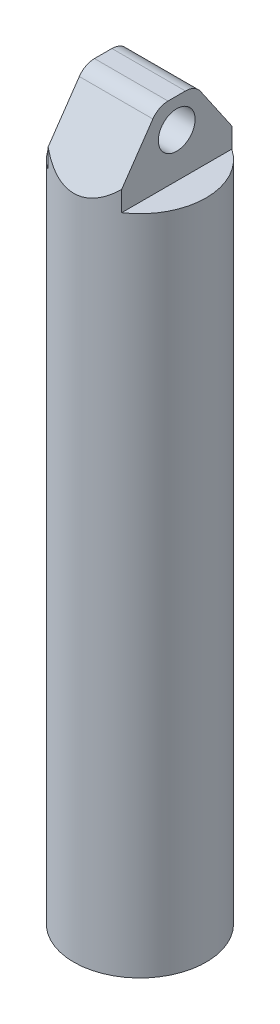
ISO-10303-21;
HEADER;
FILE_DESCRIPTION(('STEP AP214'),'2;1');
FILE_NAME('part.step','',(''),(''),'','','');
FILE_SCHEMA(('AUTOMOTIVE_DESIGN { 1 0 10303 214 1 1 1 1 }'));
ENDSEC;
DATA;
#1=APPLICATION_CONTEXT('core data for automotive mechanical design processes');
#2=APPLICATION_PROTOCOL_DEFINITION('international standard','automotive_design',2000,#1);
#3=PRODUCT_CONTEXT('',#1,'mechanical');
#4=PRODUCT('Part','Part','',(#3));
#5=PRODUCT_RELATED_PRODUCT_CATEGORY('part','',(#4));
#6=PRODUCT_DEFINITION_FORMATION('','',#4);
#7=PRODUCT_DEFINITION_CONTEXT('part definition',#1,'design');
#8=PRODUCT_DEFINITION('design','',#6,#7);
#9=PRODUCT_DEFINITION_SHAPE('','',#8);
#10=(LENGTH_UNIT() NAMED_UNIT(*) SI_UNIT(.MILLI.,.METRE.));
#11=(NAMED_UNIT(*) PLANE_ANGLE_UNIT() SI_UNIT($,.RADIAN.));
#12=(NAMED_UNIT(*) SI_UNIT($,.STERADIAN.) SOLID_ANGLE_UNIT());
#13=UNCERTAINTY_MEASURE_WITH_UNIT(LENGTH_MEASURE(1.E-05),#10,'distance_accuracy_value','');
#14=(GEOMETRIC_REPRESENTATION_CONTEXT(3) GLOBAL_UNCERTAINTY_ASSIGNED_CONTEXT((#13)) GLOBAL_UNIT_ASSIGNED_CONTEXT((#10,
#11,#12)) REPRESENTATION_CONTEXT('',''));
#15=CARTESIAN_POINT('',(0.,0.,0.));
#16=DIRECTION('',(0.,0.,1.));
#17=DIRECTION('',(1.,0.,0.));
#18=AXIS2_PLACEMENT_3D('',#15,#16,#17);
#19=CARTESIAN_POINT('',(0.,180.,0.));
#20=DIRECTION('',(0.,1.,0.));
#21=DIRECTION('',(0.,0.,1.));
#22=AXIS2_PLACEMENT_3D('',#19,#20,#21);
#23=PLANE('',#22);
#24=CARTESIAN_POINT('',(0.,180.,0.));
#25=DIRECTION('',(0.,1.,0.));
#26=DIRECTION('',(0.,0.,1.));
#27=AXIS2_PLACEMENT_3D('',#24,#25,#26);
#28=CIRCLE('',#27,18.);
#29=CARTESIAN_POINT('',(-10.,180.,-14.9666295470958));
#30=VERTEX_POINT('',#29);
#31=CARTESIAN_POINT('',(-10.,180.,14.9666295470958));
#32=VERTEX_POINT('',#31);
#33=EDGE_CURVE('E127',#30,#32,#28,.T.);
#34=ORIENTED_EDGE('',*,*,#33,.T.);
#35=DIRECTION('',(0.,0.,-1.));
#36=VECTOR('',#35,1.);
#37=CARTESIAN_POINT('',(-10.,180.,-18.7291625664917));
#38=LINE('',#37,#36);
#39=EDGE_CURVE('E123',#32,#30,#38,.T.);
#40=ORIENTED_EDGE('',*,*,#39,.T.);
#41=EDGE_LOOP('',(#34,#40));
#42=FACE_BOUND('',#41,.T.);
#43=ADVANCED_FACE('F51',(#42),#23,.T.);
#44=CARTESIAN_POINT('',(0.,180.,0.));
#45=DIRECTION('',(0.,-1.,0.));
#46=DIRECTION('',(0.,0.,-1.));
#47=AXIS2_PLACEMENT_3D('',#44,#45,#46);
#48=CYLINDRICAL_SURFACE('',#47,18.);
#49=CARTESIAN_POINT('',(10.,180.,14.9666295470957));
#50=VERTEX_POINT('',#49);
#51=CARTESIAN_POINT('',(10.,180.,-14.9666295470958));
#52=VERTEX_POINT('',#51);
#53=EDGE_CURVE('E116',#50,#52,#28,.T.);
#54=ORIENTED_EDGE('',*,*,#53,.F.);
#55=DIRECTION('',(0.,-1.,0.));
#56=VECTOR('',#55,1.);
#57=CARTESIAN_POINT('',(10.,195.,14.9666295470958));
#58=LINE('',#57,#56);
#59=CARTESIAN_POINT('',(10.,185.481081604466,14.9666295470958));
#60=VERTEX_POINT('',#59);
#61=EDGE_CURVE('E60',#60,#50,#58,.T.);
#62=ORIENTED_EDGE('',*,*,#61,.F.);
#63=CARTESIAN_POINT('',(0.,207.283765452968,0.));
#64=DIRECTION('',(0.,0.565945406006889,0.824442719307835));
#65=DIRECTION('',(0.,-0.824442719307835,0.565945406006889));
#66=AXIS2_PLACEMENT_3D('',#63,#64,#65);
#67=ELLIPSE('',#66,31.8051879367688,18.);
#68=CARTESIAN_POINT('',(-10.,185.481081604466,14.9666295470958));
#69=VERTEX_POINT('',#68);
#70=EDGE_CURVE('E224',#60,#69,#67,.F.);
#71=ORIENTED_EDGE('',*,*,#70,.T.);
#72=DIRECTION('',(0.,-1.,0.));
#73=VECTOR('',#72,1.);
#74=CARTESIAN_POINT('',(-10.,217.,14.9666295470958));
#75=LINE('',#74,#73);
#76=EDGE_CURVE('E227',#69,#32,#75,.T.);
#77=ORIENTED_EDGE('',*,*,#76,.T.);
#78=ORIENTED_EDGE('',*,*,#33,.F.);
#79=DIRECTION('',(0.,-1.,0.));
#80=VECTOR('',#79,1.);
#81=CARTESIAN_POINT('',(-10.,217.,-14.9666295470958));
#82=LINE('',#81,#80);
#83=CARTESIAN_POINT('',(-10.,185.481081604466,-14.9666295470958));
#84=VERTEX_POINT('',#83);
#85=EDGE_CURVE('E221',#30,#84,#82,.F.);
#86=ORIENTED_EDGE('',*,*,#85,.T.);
#87=CARTESIAN_POINT('',(0.,207.283765452968,0.));
#88=DIRECTION('',(0.,0.565945406006889,-0.824442719307835));
#89=DIRECTION('',(0.,-0.824442719307835,-0.565945406006889));
#90=AXIS2_PLACEMENT_3D('',#87,#88,#89);
#91=ELLIPSE('',#90,31.8051879367688,18.);
#92=CARTESIAN_POINT('',(10.,185.481081604466,-14.9666295470958));
#93=VERTEX_POINT('',#92);
#94=EDGE_CURVE('E67',#84,#93,#91,.F.);
#95=ORIENTED_EDGE('',*,*,#94,.T.);
#96=DIRECTION('',(0.,-1.,0.));
#97=VECTOR('',#96,1.);
#98=CARTESIAN_POINT('',(10.,217.,-14.9666295470958));
#99=LINE('',#98,#97);
#100=EDGE_CURVE('E12',#52,#93,#99,.F.);
#101=ORIENTED_EDGE('',*,*,#100,.F.);
#102=EDGE_LOOP('',(#54,#62,#71,#77,#78,#86,#95,#101));
#103=FACE_BOUND('',#102,.T.);
#104=CARTESIAN_POINT('',(0.,0.,0.));
#105=DIRECTION('',(0.,1.,0.));
#106=DIRECTION('',(0.,0.,1.));
#107=AXIS2_PLACEMENT_3D('',#104,#105,#106);
#108=CIRCLE('',#107,18.);
#109=CARTESIAN_POINT('',(0.,0.,18.));
#110=VERTEX_POINT('',#109);
#111=EDGE_CURVE('E134',#110,#110,#108,.T.);
#112=ORIENTED_EDGE('',*,*,#111,.T.);
#113=EDGE_LOOP('',(#112));
#114=FACE_BOUND('',#113,.T.);
#115=ADVANCED_FACE('F53',(#103,#114),#48,.T.);
#116=DIRECTION('',(0.,0.,-1.));
#117=VECTOR('',#116,1.);
#118=CARTESIAN_POINT('',(10.,180.,-18.7291625664917));
#119=LINE('',#118,#117);
#120=EDGE_CURVE('E118',#50,#52,#119,.T.);
#121=ORIENTED_EDGE('',*,*,#120,.F.);
#122=ORIENTED_EDGE('',*,*,#53,.T.);
#123=EDGE_LOOP('',(#121,#122));
#124=FACE_BOUND('',#123,.T.);
#125=ADVANCED_FACE('F125',(#124),#23,.T.);
#126=CARTESIAN_POINT('',(0.,0.,0.));
#127=DIRECTION('',(0.,1.,0.));
#128=DIRECTION('',(0.,0.,1.));
#129=AXIS2_PLACEMENT_3D('',#126,#127,#128);
#130=PLANE('',#129);
#131=ORIENTED_EDGE('',*,*,#111,.F.);
#132=EDGE_LOOP('',(#131));
#133=FACE_BOUND('',#132,.T.);
#134=CARTESIAN_POINT('',(0.,0.,0.));
#135=DIRECTION('',(0.,-1.,0.));
#136=DIRECTION('',(0.,0.,-1.));
#137=AXIS2_PLACEMENT_3D('',#134,#135,#136);
#138=CIRCLE('',#137,10.);
#139=CARTESIAN_POINT('',(0.,0.,-10.));
#140=VERTEX_POINT('',#139);
#141=EDGE_CURVE('E155',#140,#140,#138,.T.);
#142=ORIENTED_EDGE('',*,*,#141,.F.);
#143=EDGE_LOOP('',(#142));
#144=FACE_BOUND('',#143,.T.);
#145=ADVANCED_FACE('F247',(#133,#144),#130,.F.);
#146=CARTESIAN_POINT('',(0.,5.,0.));
#147=DIRECTION('',(0.,-1.,0.));
#148=DIRECTION('',(0.,0.,-1.));
#149=AXIS2_PLACEMENT_3D('',#146,#147,#148);
#150=PLANE('',#149);
#151=CARTESIAN_POINT('',(0.,5.,0.));
#152=DIRECTION('',(0.,-1.,0.));
#153=DIRECTION('',(0.,0.,-1.));
#154=AXIS2_PLACEMENT_3D('',#151,#152,#153);
#155=CIRCLE('',#154,10.);
#156=CARTESIAN_POINT('',(0.,5.,-10.));
#157=VERTEX_POINT('',#156);
#158=EDGE_CURVE('E150',#157,#157,#155,.T.);
#159=ORIENTED_EDGE('',*,*,#158,.T.);
#160=EDGE_LOOP('',(#159));
#161=FACE_BOUND('',#160,.T.);
#162=CARTESIAN_POINT('',(0.,5.,0.));
#163=DIRECTION('',(0.,-1.,0.));
#164=DIRECTION('',(0.,0.,-1.));
#165=AXIS2_PLACEMENT_3D('',#162,#163,#164);
#166=CIRCLE('',#165,17.);
#167=CARTESIAN_POINT('',(0.,4.99999999999998,-17.));
#168=VERTEX_POINT('',#167);
#169=EDGE_CURVE('E145',#168,#168,#166,.T.);
#170=ORIENTED_EDGE('',*,*,#169,.F.);
#171=EDGE_LOOP('',(#170));
#172=FACE_BOUND('',#171,.T.);
#173=ADVANCED_FACE('F252',(#161,#172),#150,.F.);
#174=CARTESIAN_POINT('',(0.,5.,0.));
#175=DIRECTION('',(0.,-1.,0.));
#176=DIRECTION('',(0.,0.,-1.));
#177=AXIS2_PLACEMENT_3D('',#174,#175,#176);
#178=CYLINDRICAL_SURFACE('',#177,10.);
#179=ORIENTED_EDGE('',*,*,#158,.F.);
#180=EDGE_LOOP('',(#179));
#181=FACE_BOUND('',#180,.T.);
#182=ORIENTED_EDGE('',*,*,#141,.T.);
#183=EDGE_LOOP('',(#182));
#184=FACE_BOUND('',#183,.T.);
#185=ADVANCED_FACE('F258',(#181,#184),#178,.F.);
#186=CARTESIAN_POINT('',(0.,179.,0.));
#187=DIRECTION('',(0.,1.,0.));
#188=DIRECTION('',(0.,0.,1.));
#189=AXIS2_PLACEMENT_3D('',#186,#187,#188);
#190=PLANE('',#189);
#191=CARTESIAN_POINT('',(0.,179.,0.));
#192=DIRECTION('',(0.,1.,0.));
#193=DIRECTION('',(0.,0.,1.));
#194=AXIS2_PLACEMENT_3D('',#191,#192,#193);
#195=CIRCLE('',#194,17.);
#196=CARTESIAN_POINT('',(0.,179.,-17.));
#197=VERTEX_POINT('',#196);
#198=EDGE_CURVE('E137',#197,#197,#195,.T.);
#199=ORIENTED_EDGE('',*,*,#198,.F.);
#200=EDGE_LOOP('',(#199));
#201=FACE_BOUND('',#200,.T.);
#202=ADVANCED_FACE('F265',(#201),#190,.F.);
#203=CARTESIAN_POINT('',(0.,180.,0.));
#204=DIRECTION('',(0.,-1.,0.));
#205=DIRECTION('',(0.,0.,-1.));
#206=AXIS2_PLACEMENT_3D('',#203,#204,#205);
#207=CYLINDRICAL_SURFACE('',#206,17.);
#208=CARTESIAN_POINT('',(0.,179.,-17.));
#209=CARTESIAN_POINT('',(0.,177.1875,-17.));
#210=CARTESIAN_POINT('',(0.,175.375,-17.));
#211=CARTESIAN_POINT('',(0.,171.75,-17.));
#212=CARTESIAN_POINT('',(0.,169.9375,-17.));
#213=CARTESIAN_POINT('',(0.,166.3125,-17.));
#214=CARTESIAN_POINT('',(0.,164.5,-17.));
#215=CARTESIAN_POINT('',(0.,160.875,-17.));
#216=CARTESIAN_POINT('',(0.,159.0625,-17.));
#217=CARTESIAN_POINT('',(0.,155.4375,-17.));
#218=CARTESIAN_POINT('',(0.,153.625,-17.));
#219=CARTESIAN_POINT('',(0.,150.,-17.));
#220=CARTESIAN_POINT('',(0.,148.1875,-17.));
#221=CARTESIAN_POINT('',(0.,144.5625,-17.));
#222=CARTESIAN_POINT('',(0.,142.75,-17.));
#223=CARTESIAN_POINT('',(0.,139.125,-17.));
#224=CARTESIAN_POINT('',(0.,137.3125,-17.));
#225=CARTESIAN_POINT('',(0.,133.6875,-17.));
#226=CARTESIAN_POINT('',(0.,131.875,-17.));
#227=CARTESIAN_POINT('',(0.,128.25,-17.));
#228=CARTESIAN_POINT('',(0.,126.4375,-17.));
#229=CARTESIAN_POINT('',(0.,122.8125,-17.));
#230=CARTESIAN_POINT('',(0.,121.,-17.));
#231=CARTESIAN_POINT('',(0.,117.375,-17.));
#232=CARTESIAN_POINT('',(0.,115.5625,-17.));
#233=CARTESIAN_POINT('',(0.,111.9375,-17.));
#234=CARTESIAN_POINT('',(0.,110.125,-17.));
#235=CARTESIAN_POINT('',(0.,106.5,-17.));
#236=CARTESIAN_POINT('',(0.,104.6875,-17.));
#237=CARTESIAN_POINT('',(0.,101.0625,-17.));
#238=CARTESIAN_POINT('',(0.,99.25,-17.));
#239=CARTESIAN_POINT('',(0.,95.625,-17.));
#240=CARTESIAN_POINT('',(0.,93.8125,-17.));
#241=CARTESIAN_POINT('',(0.,90.1875,-17.));
#242=CARTESIAN_POINT('',(0.,88.375,-17.));
#243=CARTESIAN_POINT('',(0.,84.75,-17.));
#244=CARTESIAN_POINT('',(0.,82.9375,-17.));
#245=CARTESIAN_POINT('',(0.,79.3125,-17.));
#246=CARTESIAN_POINT('',(0.,77.5,-17.));
#247=CARTESIAN_POINT('',(0.,73.875,-17.));
#248=CARTESIAN_POINT('',(0.,72.0625,-17.));
#249=CARTESIAN_POINT('',(0.,68.4375,-17.));
#250=CARTESIAN_POINT('',(0.,66.625,-17.));
#251=CARTESIAN_POINT('',(0.,63.,-17.));
#252=CARTESIAN_POINT('',(0.,61.1875,-17.));
#253=CARTESIAN_POINT('',(0.,57.5625,-17.));
#254=CARTESIAN_POINT('',(0.,55.75,-17.));
#255=CARTESIAN_POINT('',(0.,52.125,-17.));
#256=CARTESIAN_POINT('',(0.,50.3125,-17.));
#257=CARTESIAN_POINT('',(0.,46.6875,-17.));
#258=CARTESIAN_POINT('',(0.,44.875,-17.));
#259=CARTESIAN_POINT('',(0.,41.25,-17.));
#260=CARTESIAN_POINT('',(0.,39.4375,-17.));
#261=CARTESIAN_POINT('',(0.,35.8125,-17.));
#262=CARTESIAN_POINT('',(0.,34.,-17.));
#263=CARTESIAN_POINT('',(0.,30.375,-17.));
#264=CARTESIAN_POINT('',(0.,28.5625,-17.));
#265=CARTESIAN_POINT('',(0.,24.9375,-17.));
#266=CARTESIAN_POINT('',(0.,23.125,-17.));
#267=CARTESIAN_POINT('',(0.,19.5,-17.));
#268=CARTESIAN_POINT('',(0.,17.6875,-17.));
#269=CARTESIAN_POINT('',(0.,14.0625,-17.));
#270=CARTESIAN_POINT('',(0.,12.25,-17.));
#271=CARTESIAN_POINT('',(0.,8.62499999999999,-17.));
#272=CARTESIAN_POINT('',(0.,6.81249999999998,-17.));
#273=CARTESIAN_POINT('',(0.,4.99999999999998,-17.));
#274=B_SPLINE_CURVE_WITH_KNOTS('',3,(#208,#209,#210,#211,#212,#213,#214,#215,#216,#217,#218,
#219,#220,#221,#222,#223,#224,#225,#226,#227,#228,#229,#230,#231,#232,#233,#234,#235,#236,#237,
#238,#239,#240,#241,#242,#243,#244,#245,#246,#247,#248,#249,#250,#251,#252,#253,#254,#255,#256,
#257,#258,#259,#260,#261,#262,#263,#264,#265,#266,#267,#268,#269,#270,#271,#272,#273),
.UNSPECIFIED.,.F.,.F.,(4,2,2,2,2,2,2,2,2,2,2,2,2,2,2,2,2,2,2,2,2,2,2,2,2,2,2,2,2,2,2,2,4),(0.,
5.43749999999998,10.875,16.3125,21.75,27.1875,32.625,38.0625,43.5,48.9375,54.375,59.8125,65.25,
70.6875,76.125,81.5625,87.,92.4375,97.875,103.3125,108.75,114.1875,119.625,125.0625,130.5,
135.9375,141.375,146.8125,152.25,157.6875,163.125,168.5625,174.),.UNSPECIFIED.);
#275=EDGE_CURVE('BSEAM271',#197,#168,#274,.T.);
#276=ORIENTED_EDGE('',*,*,#198,.T.);
#277=ORIENTED_EDGE('',*,*,#169,.T.);
#278=ORIENTED_EDGE('',*,*,#275,.T.);
#279=ORIENTED_EDGE('',*,*,#275,.F.);
#280=EDGE_LOOP('',(#276,#278,#277,#279));
#281=FACE_BOUND('',#280,.T.);
#282=ADVANCED_FACE('F271',(#281),#207,.F.);
#283=CARTESIAN_POINT('',(-10.,195.,-2.36758792437682));
#284=DIRECTION('',(1.,0.,0.));
#285=DIRECTION('',(0.,0.,-1.));
#286=AXIS2_PLACEMENT_3D('',#283,#284,#285);
#287=CYLINDRICAL_SURFACE('',#286,5.00000000000005);
#288=DIRECTION('',(1.,0.,0.));
#289=VECTOR('',#288,1.);
#290=CARTESIAN_POINT('',(-10.,200.,-2.36758792437682));
#291=LINE('',#290,#289);
#292=CARTESIAN_POINT('',(-10.,200.,-2.36758792437682));
#293=VERTEX_POINT('',#292);
#294=CARTESIAN_POINT('',(10.,200.,-2.36758792437682));
#295=VERTEX_POINT('',#294);
#296=EDGE_CURVE('E162',#293,#295,#291,.T.);
#297=ORIENTED_EDGE('',*,*,#296,.T.);
#298=CARTESIAN_POINT('',(10.,195.,-2.36758792437682));
#299=DIRECTION('',(1.,0.,0.));
#300=DIRECTION('',(0.,0.,1.));
#301=AXIS2_PLACEMENT_3D('',#298,#299,#300);
#302=CIRCLE('',#301,5.00000000000005);
#303=CARTESIAN_POINT('',(10.,197.829727030034,-6.489801520916));
#304=VERTEX_POINT('',#303);
#305=EDGE_CURVE('E211',#304,#295,#302,.T.);
#306=ORIENTED_EDGE('',*,*,#305,.F.);
#307=DIRECTION('',(1.,0.,0.));
#308=VECTOR('',#307,1.);
#309=CARTESIAN_POINT('',(-10.,197.829727030034,-6.489801520916));
#310=LINE('',#309,#308);
#311=CARTESIAN_POINT('',(-10.,197.829727030034,-6.489801520916));
#312=VERTEX_POINT('',#311);
#313=EDGE_CURVE('E160',#312,#304,#310,.T.);
#314=ORIENTED_EDGE('',*,*,#313,.F.);
#315=CARTESIAN_POINT('',(-10.,195.,-2.36758792437682));
#316=DIRECTION('',(1.,0.,0.));
#317=DIRECTION('',(0.,0.,1.));
#318=AXIS2_PLACEMENT_3D('',#315,#316,#317);
#319=CIRCLE('',#318,5.00000000000005);
#320=EDGE_CURVE('E189',#312,#293,#319,.T.);
#321=ORIENTED_EDGE('',*,*,#320,.T.);
#322=EDGE_LOOP('',(#297,#306,#314,#321));
#323=FACE_BOUND('',#322,.T.);
#324=ADVANCED_FACE('F275',(#323),#287,.T.);
#325=CARTESIAN_POINT('',(-10.,197.829727030034,-6.489801520916));
#326=DIRECTION('',(0.,0.565945406006889,-0.824442719307835));
#327=DIRECTION('',(0.,0.824442719307835,0.565945406006889));
#328=AXIS2_PLACEMENT_3D('',#325,#326,#327);
#329=PLANE('',#328);
#330=ORIENTED_EDGE('',*,*,#94,.F.);
#331=DIRECTION('',(0.,0.824442719307835,0.565945406006889));
#332=VECTOR('',#331,1.);
#333=CARTESIAN_POINT('',(-10.,197.829727030034,-6.489801520916));
#334=LINE('',#333,#332);
#335=EDGE_CURVE('E166',#84,#312,#334,.T.);
#336=ORIENTED_EDGE('',*,*,#335,.T.);
#337=ORIENTED_EDGE('',*,*,#313,.T.);
#338=DIRECTION('',(0.,0.824442719307835,0.565945406006889));
#339=VECTOR('',#338,1.);
#340=CARTESIAN_POINT('',(10.,197.829727030034,-6.489801520916));
#341=LINE('',#340,#339);
#342=EDGE_CURVE('E197',#93,#304,#341,.T.);
#343=ORIENTED_EDGE('',*,*,#342,.F.);
#344=EDGE_LOOP('',(#330,#336,#337,#343));
#345=FACE_BOUND('',#344,.T.);
#346=ADVANCED_FACE('F281',(#345),#329,.T.);
#347=CARTESIAN_POINT('',(-10.,197.829727030034,6.489801520916));
#348=DIRECTION('',(0.,0.565945406006889,0.824442719307835));
#349=DIRECTION('',(0.,-0.824442719307835,0.565945406006889));
#350=AXIS2_PLACEMENT_3D('',#347,#348,#349);
#351=PLANE('',#350);
#352=ORIENTED_EDGE('',*,*,#70,.F.);
#353=DIRECTION('',(0.,-0.824442719307835,0.565945406006889));
#354=VECTOR('',#353,1.);
#355=CARTESIAN_POINT('',(10.,197.829727030034,6.489801520916));
#356=LINE('',#355,#354);
#357=CARTESIAN_POINT('',(10.,197.829727030034,6.48980152091603));
#358=VERTEX_POINT('',#357);
#359=EDGE_CURVE('E199',#358,#60,#356,.T.);
#360=ORIENTED_EDGE('',*,*,#359,.F.);
#361=DIRECTION('',(1.,0.,0.));
#362=VECTOR('',#361,1.);
#363=CARTESIAN_POINT('',(-10.,197.829727030034,6.48980152091603));
#364=LINE('',#363,#362);
#365=CARTESIAN_POINT('',(-10.,197.829727030034,6.48980152091603));
#366=VERTEX_POINT('',#365);
#367=EDGE_CURVE('E169',#366,#358,#364,.T.);
#368=ORIENTED_EDGE('',*,*,#367,.F.);
#369=DIRECTION('',(0.,-0.824442719307835,0.565945406006889));
#370=VECTOR('',#369,1.);
#371=CARTESIAN_POINT('',(-10.,197.829727030034,6.489801520916));
#372=LINE('',#371,#370);
#373=EDGE_CURVE('E176',#366,#69,#372,.T.);
#374=ORIENTED_EDGE('',*,*,#373,.T.);
#375=EDGE_LOOP('',(#352,#360,#368,#374));
#376=FACE_BOUND('',#375,.T.);
#377=ADVANCED_FACE('F286',(#376),#351,.T.);
#378=CARTESIAN_POINT('',(-10.,195.,2.36758792437682));
#379=DIRECTION('',(1.,0.,0.));
#380=DIRECTION('',(0.,0.,-1.));
#381=AXIS2_PLACEMENT_3D('',#378,#379,#380);
#382=CYLINDRICAL_SURFACE('',#381,5.00000000000005);
#383=ORIENTED_EDGE('',*,*,#367,.T.);
#384=CARTESIAN_POINT('',(10.,195.,2.36758792437682));
#385=DIRECTION('',(1.,0.,0.));
#386=DIRECTION('',(0.,0.,-1.));
#387=AXIS2_PLACEMENT_3D('',#384,#385,#386);
#388=CIRCLE('',#387,5.00000000000005);
#389=CARTESIAN_POINT('',(10.,200.,2.36758792437682));
#390=VERTEX_POINT('',#389);
#391=EDGE_CURVE('E203',#390,#358,#388,.T.);
#392=ORIENTED_EDGE('',*,*,#391,.F.);
#393=DIRECTION('',(1.,0.,0.));
#394=VECTOR('',#393,1.);
#395=CARTESIAN_POINT('',(-10.,200.,2.36758792437682));
#396=LINE('',#395,#394);
#397=CARTESIAN_POINT('',(-10.,200.,2.36758792437682));
#398=VERTEX_POINT('',#397);
#399=EDGE_CURVE('E165',#398,#390,#396,.T.);
#400=ORIENTED_EDGE('',*,*,#399,.F.);
#401=CARTESIAN_POINT('',(-10.,195.,2.36758792437682));
#402=DIRECTION('',(1.,0.,0.));
#403=DIRECTION('',(0.,0.,-1.));
#404=AXIS2_PLACEMENT_3D('',#401,#402,#403);
#405=CIRCLE('',#404,5.00000000000005);
#406=EDGE_CURVE('E181',#398,#366,#405,.T.);
#407=ORIENTED_EDGE('',*,*,#406,.T.);
#408=EDGE_LOOP('',(#383,#392,#400,#407));
#409=FACE_BOUND('',#408,.T.);
#410=ADVANCED_FACE('F299',(#409),#382,.T.);
#411=CARTESIAN_POINT('',(-10.,200.,2.36758792437682));
#412=DIRECTION('',(0.,1.,0.));
#413=DIRECTION('',(0.,0.,1.));
#414=AXIS2_PLACEMENT_3D('',#411,#412,#413);
#415=PLANE('',#414);
#416=ORIENTED_EDGE('',*,*,#399,.T.);
#417=DIRECTION('',(0.,0.,1.));
#418=VECTOR('',#417,1.);
#419=CARTESIAN_POINT('',(10.,200.,2.36758792437682));
#420=LINE('',#419,#418);
#421=EDGE_CURVE('E207',#295,#390,#420,.T.);
#422=ORIENTED_EDGE('',*,*,#421,.F.);
#423=ORIENTED_EDGE('',*,*,#296,.F.);
#424=DIRECTION('',(0.,0.,1.));
#425=VECTOR('',#424,1.);
#426=CARTESIAN_POINT('',(-10.,200.,2.36758792437682));
#427=LINE('',#426,#425);
#428=EDGE_CURVE('E185',#293,#398,#427,.T.);
#429=ORIENTED_EDGE('',*,*,#428,.T.);
#430=EDGE_LOOP('',(#416,#422,#423,#429));
#431=FACE_BOUND('',#430,.T.);
#432=ADVANCED_FACE('F295',(#431),#415,.T.);
#433=CARTESIAN_POINT('',(-10.,195.,-2.36758792437682));
#434=DIRECTION('',(-1.,0.,0.));
#435=DIRECTION('',(0.,0.,1.));
#436=AXIS2_PLACEMENT_3D('',#433,#434,#435);
#437=PLANE('',#436);
#438=ORIENTED_EDGE('',*,*,#85,.F.);
#439=ORIENTED_EDGE('',*,*,#39,.F.);
#440=ORIENTED_EDGE('',*,*,#76,.F.);
#441=ORIENTED_EDGE('',*,*,#373,.F.);
#442=ORIENTED_EDGE('',*,*,#406,.F.);
#443=ORIENTED_EDGE('',*,*,#428,.F.);
#444=ORIENTED_EDGE('',*,*,#320,.F.);
#445=ORIENTED_EDGE('',*,*,#335,.F.);
#446=EDGE_LOOP('',(#438,#439,#440,#441,#442,#443,#444,#445));
#447=FACE_BOUND('',#446,.T.);
#448=CARTESIAN_POINT('',(-10.,192.,0.));
#449=DIRECTION('',(1.,0.,0.));
#450=DIRECTION('',(0.,0.,-1.));
#451=AXIS2_PLACEMENT_3D('',#448,#449,#450);
#452=CIRCLE('',#451,5.00000000000001);
#453=CARTESIAN_POINT('',(-10.,192.,-5.00000000000001));
#454=VERTEX_POINT('',#453);
#455=EDGE_CURVE('E193',#454,#454,#452,.T.);
#456=ORIENTED_EDGE('',*,*,#455,.T.);
#457=EDGE_LOOP('',(#456));
#458=FACE_BOUND('',#457,.T.);
#459=ADVANCED_FACE('F235',(#447,#458),#437,.T.);
#460=CARTESIAN_POINT('',(-10.,192.,0.));
#461=DIRECTION('',(1.,0.,0.));
#462=DIRECTION('',(0.,0.,-1.));
#463=AXIS2_PLACEMENT_3D('',#460,#461,#462);
#464=CYLINDRICAL_SURFACE('',#463,5.00000000000001);
#465=ORIENTED_EDGE('',*,*,#455,.F.);
#466=EDGE_LOOP('',(#465));
#467=FACE_BOUND('',#466,.T.);
#468=CARTESIAN_POINT('',(10.,192.,0.));
#469=DIRECTION('',(1.,0.,0.));
#470=DIRECTION('',(0.,0.,-1.));
#471=AXIS2_PLACEMENT_3D('',#468,#469,#470);
#472=CIRCLE('',#471,5.00000000000001);
#473=CARTESIAN_POINT('',(10.,192.,-5.00000000000001));
#474=VERTEX_POINT('',#473);
#475=EDGE_CURVE('E215',#474,#474,#472,.T.);
#476=ORIENTED_EDGE('',*,*,#475,.T.);
#477=EDGE_LOOP('',(#476));
#478=FACE_BOUND('',#477,.T.);
#479=ADVANCED_FACE('F312',(#467,#478),#464,.F.);
#480=CARTESIAN_POINT('',(10.,195.,-2.36758792437682));
#481=DIRECTION('',(-1.,0.,0.));
#482=DIRECTION('',(0.,0.,1.));
#483=AXIS2_PLACEMENT_3D('',#480,#481,#482);
#484=PLANE('',#483);
#485=ORIENTED_EDGE('',*,*,#120,.T.);
#486=ORIENTED_EDGE('',*,*,#100,.T.);
#487=ORIENTED_EDGE('',*,*,#342,.T.);
#488=ORIENTED_EDGE('',*,*,#305,.T.);
#489=ORIENTED_EDGE('',*,*,#421,.T.);
#490=ORIENTED_EDGE('',*,*,#391,.T.);
#491=ORIENTED_EDGE('',*,*,#359,.T.);
#492=ORIENTED_EDGE('',*,*,#61,.T.);
#493=EDGE_LOOP('',(#485,#486,#487,#488,#489,#490,#491,#492));
#494=FACE_BOUND('',#493,.T.);
#495=ORIENTED_EDGE('',*,*,#475,.F.);
#496=EDGE_LOOP('',(#495));
#497=FACE_BOUND('',#496,.T.);
#498=ADVANCED_FACE('F119',(#494,#497),#484,.F.);
#499=CLOSED_SHELL('',(#43,#115,#125,#145,#173,#185,#202,#282,#324,#346,#377,#410,#432,#459,#479,#498));
#500=MANIFOLD_SOLID_BREP('B2',#499);
#501=ADVANCED_BREP_SHAPE_REPRESENTATION('',(#18,#500),#14);
#502=SHAPE_DEFINITION_REPRESENTATION(#9,#501);
ENDSEC;
END-ISO-10303-21;
